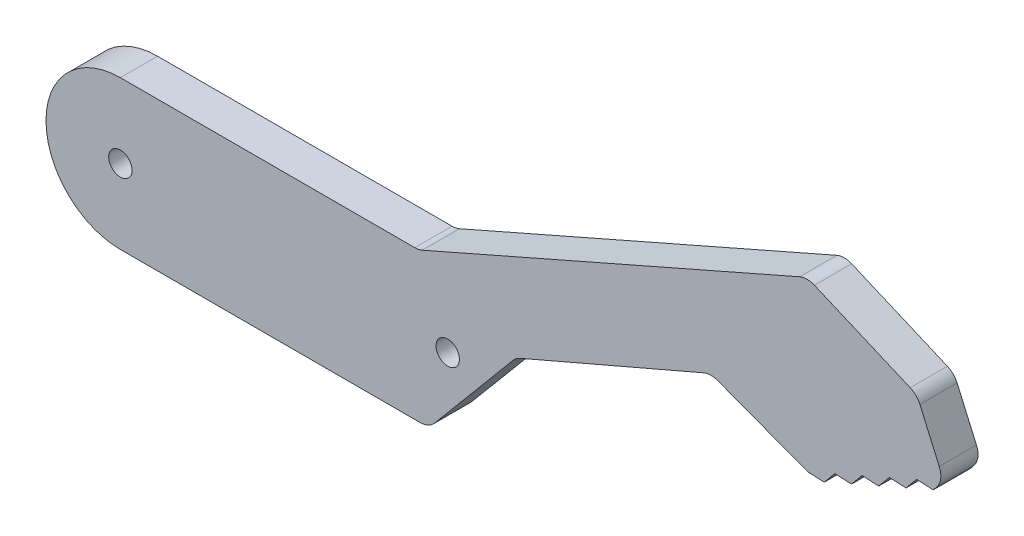
ISO-10303-21;
HEADER;
FILE_DESCRIPTION(('STEP AP214'),'2;1');
FILE_NAME('part.step','',(''),(''),'','','');
FILE_SCHEMA(('AUTOMOTIVE_DESIGN { 1 0 10303 214 1 1 1 1 }'));
ENDSEC;
DATA;
#1=APPLICATION_CONTEXT('core data for automotive mechanical design processes');
#2=APPLICATION_PROTOCOL_DEFINITION('international standard','automotive_design',2000,#1);
#3=PRODUCT_CONTEXT('',#1,'mechanical');
#4=PRODUCT('Part','Part','',(#3));
#5=PRODUCT_RELATED_PRODUCT_CATEGORY('part','',(#4));
#6=PRODUCT_DEFINITION_FORMATION('','',#4);
#7=PRODUCT_DEFINITION_CONTEXT('part definition',#1,'design');
#8=PRODUCT_DEFINITION('design','',#6,#7);
#9=PRODUCT_DEFINITION_SHAPE('','',#8);
#10=(LENGTH_UNIT() NAMED_UNIT(*) SI_UNIT(.MILLI.,.METRE.));
#11=(NAMED_UNIT(*) PLANE_ANGLE_UNIT() SI_UNIT($,.RADIAN.));
#12=(NAMED_UNIT(*) SI_UNIT($,.STERADIAN.) SOLID_ANGLE_UNIT());
#13=UNCERTAINTY_MEASURE_WITH_UNIT(LENGTH_MEASURE(1.E-05),#10,'distance_accuracy_value','');
#14=(GEOMETRIC_REPRESENTATION_CONTEXT(3) GLOBAL_UNCERTAINTY_ASSIGNED_CONTEXT((#13)) GLOBAL_UNIT_ASSIGNED_CONTEXT((#10,
#11,#12)) REPRESENTATION_CONTEXT('',''));
#15=CARTESIAN_POINT('',(0.,0.,0.));
#16=DIRECTION('',(0.,0.,1.));
#17=DIRECTION('',(1.,0.,0.));
#18=AXIS2_PLACEMENT_3D('',#15,#16,#17);
#19=CARTESIAN_POINT('',(58.5331131388832,-49.0978644296095,10.));
#20=DIRECTION('',(0.766155606422822,-0.6426551071507,0.));
#21=DIRECTION('',(0.6426551071507,0.766155606422822,0.));
#22=AXIS2_PLACEMENT_3D('',#19,#20,#21);
#23=PLANE('',#22);
#24=DIRECTION('',(-0.6426551071507,-0.766155606422822,0.));
#25=VECTOR('',#24,1.);
#26=CARTESIAN_POINT('',(58.5331131388832,-49.0978644296095,0.));
#27=LINE('',#26,#25);
#28=CARTESIAN_POINT('',(105.601666444923,7.01596023369886,0.));
#29=VERTEX_POINT('',#28);
#30=CARTESIAN_POINT('',(84.4392588597991,-18.2132755357535,0.));
#31=VERTEX_POINT('',#30);
#32=EDGE_CURVE('E404',#29,#31,#27,.T.);
#33=ORIENTED_EDGE('',*,*,#32,.F.);
#34=DIRECTION('',(0.,0.,-1.));
#35=VECTOR('',#34,1.);
#36=CARTESIAN_POINT('',(105.601666444923,7.01596023369886,10.));
#37=LINE('',#36,#35);
#38=CARTESIAN_POINT('',(105.601666444923,7.01596023369886,10.));
#39=VERTEX_POINT('',#38);
#40=EDGE_CURVE('E310',#29,#39,#37,.F.);
#41=ORIENTED_EDGE('',*,*,#40,.T.);
#42=DIRECTION('',(-0.6426551071507,-0.766155606422822,0.));
#43=VECTOR('',#42,1.);
#44=CARTESIAN_POINT('',(58.5331131388832,-49.0978644296095,10.));
#45=LINE('',#44,#43);
#46=CARTESIAN_POINT('',(84.4392588597991,-18.2132755357535,10.));
#47=VERTEX_POINT('',#46);
#48=EDGE_CURVE('E865',#39,#47,#45,.T.);
#49=ORIENTED_EDGE('',*,*,#48,.T.);
#50=DIRECTION('',(0.,0.,-1.));
#51=VECTOR('',#50,1.);
#52=CARTESIAN_POINT('',(84.4392588597991,-18.2132755357535,0.));
#53=LINE('',#52,#51);
#54=EDGE_CURVE('E306',#47,#31,#53,.T.);
#55=ORIENTED_EDGE('',*,*,#54,.T.);
#56=EDGE_LOOP('',(#33,#41,#49,#55));
#57=FACE_BOUND('',#56,.T.);
#58=ADVANCED_FACE('F43',(#57),#23,.T.);
#59=CARTESIAN_POINT('',(13.8136134535087,-32.0122174687386,10.));
#60=DIRECTION('',(0.39619803148616,-0.918165083112232,0.));
#61=DIRECTION('',(0.918165083112232,0.39619803148616,0.));
#62=AXIS2_PLACEMENT_3D('',#59,#60,#61);
#63=PLANE('',#62);
#64=DIRECTION('',(-0.918165083112232,-0.39619803148616,0.));
#65=VECTOR('',#64,1.);
#66=CARTESIAN_POINT('',(13.8136134535087,-32.0122174687386,0.));
#67=LINE('',#66,#65);
#68=CARTESIAN_POINT('',(156.8071709302,29.6910285264515,0.));
#69=VERTEX_POINT('',#68);
#70=CARTESIAN_POINT('',(107.451454319606,8.39351011350651,0.));
#71=VERTEX_POINT('',#70);
#72=EDGE_CURVE('E408',#69,#71,#67,.T.);
#73=ORIENTED_EDGE('',*,*,#72,.F.);
#74=DIRECTION('',(0.,0.,-1.));
#75=VECTOR('',#74,1.);
#76=CARTESIAN_POINT('',(156.8071709302,29.6910285264515,10.));
#77=LINE('',#76,#75);
#78=CARTESIAN_POINT('',(156.8071709302,29.6910285264515,10.));
#79=VERTEX_POINT('',#78);
#80=EDGE_CURVE('E303',#69,#79,#77,.F.);
#81=ORIENTED_EDGE('',*,*,#80,.T.);
#82=DIRECTION('',(-0.918165083112232,-0.39619803148616,0.));
#83=VECTOR('',#82,1.);
#84=CARTESIAN_POINT('',(13.8136134535087,-32.0122174687386,10.));
#85=LINE('',#84,#83);
#86=CARTESIAN_POINT('',(107.451454319606,8.39351011350651,10.));
#87=VERTEX_POINT('',#86);
#88=EDGE_CURVE('E872',#79,#87,#85,.T.);
#89=ORIENTED_EDGE('',*,*,#88,.T.);
#90=DIRECTION('',(0.,0.,-1.));
#91=VECTOR('',#90,1.);
#92=CARTESIAN_POINT('',(107.451454319606,8.39351011350651,0.));
#93=LINE('',#92,#91);
#94=EDGE_CURVE('E299',#87,#71,#93,.T.);
#95=ORIENTED_EDGE('',*,*,#94,.T.);
#96=EDGE_LOOP('',(#73,#81,#89,#95));
#97=FACE_BOUND('',#96,.T.);
#98=ADVANCED_FACE('F587',(#97),#63,.T.);
#99=CARTESIAN_POINT('',(29.8153393740067,79.0738902355573,10.));
#100=DIRECTION('',(-0.352810047583274,-0.935694966495112,0.));
#101=DIRECTION('',(0.935694966495112,-0.352810047583274,0.));
#102=AXIS2_PLACEMENT_3D('',#99,#100,#101);
#103=PLANE('',#102);
#104=DIRECTION('',(-0.935694966495112,0.352810047583274,0.));
#105=VECTOR('',#104,1.);
#106=CARTESIAN_POINT('',(29.8153393740067,79.0738902355573,0.));
#107=LINE('',#106,#105);
#108=CARTESIAN_POINT('',(184.023245086636,20.9287676258012,0.));
#109=VERTEX_POINT('',#108);
#110=CARTESIAN_POINT('',(160.552211325547,29.7786779433659,0.));
#111=VERTEX_POINT('',#110);
#112=EDGE_CURVE('E412',#109,#111,#107,.T.);
#113=ORIENTED_EDGE('',*,*,#112,.F.);
#114=DIRECTION('',(0.,0.,-1.));
#115=VECTOR('',#114,1.);
#116=CARTESIAN_POINT('',(184.023245086636,20.9287676258012,10.));
#117=LINE('',#116,#115);
#118=CARTESIAN_POINT('',(184.023245086636,20.9287676258012,10.));
#119=VERTEX_POINT('',#118);
#120=EDGE_CURVE('E282',#109,#119,#117,.F.);
#121=ORIENTED_EDGE('',*,*,#120,.T.);
#122=DIRECTION('',(-0.935694966495112,0.352810047583274,0.));
#123=VECTOR('',#122,1.);
#124=CARTESIAN_POINT('',(29.8153393740067,79.0738902355573,10.));
#125=LINE('',#124,#123);
#126=CARTESIAN_POINT('',(160.552211325547,29.7786779433659,10.));
#127=VERTEX_POINT('',#126);
#128=EDGE_CURVE('E237',#119,#127,#125,.T.);
#129=ORIENTED_EDGE('',*,*,#128,.T.);
#130=DIRECTION('',(0.,0.,-1.));
#131=VECTOR('',#130,1.);
#132=CARTESIAN_POINT('',(160.552211325547,29.7786779433659,0.));
#133=LINE('',#132,#131);
#134=EDGE_CURVE('E278',#127,#111,#133,.T.);
#135=ORIENTED_EDGE('',*,*,#134,.T.);
#136=EDGE_LOOP('',(#113,#121,#129,#135));
#137=FACE_BOUND('',#136,.T.);
#138=ADVANCED_FACE('F593',(#137),#103,.T.);
#139=CARTESIAN_POINT('',(1.49259334809687,29.8242520221806,10.));
#140=DIRECTION('',(0.0499837398291641,0.998750031665927,0.));
#141=DIRECTION('',(-0.998750031665927,0.0499837398291641,0.));
#142=AXIS2_PLACEMENT_3D('',#139,#140,#141);
#143=PLANE('',#142);
#144=DIRECTION('',(0.998750031665927,-0.0499837398291641,0.));
#145=VECTOR('',#144,1.);
#146=CARTESIAN_POINT('',(1.49259334809687,29.8242520221806,10.));
#147=LINE('',#146,#145);
#148=CARTESIAN_POINT('',(185.537376625407,20.6134922999471,10.));
#149=VERTEX_POINT('',#148);
#150=CARTESIAN_POINT('',(189.22217950757,20.4290815637826,10.));
#151=VERTEX_POINT('',#150);
#152=EDGE_CURVE('E223',#149,#151,#147,.T.);
#153=ORIENTED_EDGE('',*,*,#152,.F.);
#154=DIRECTION('',(0.,0.,-1.));
#155=VECTOR('',#154,1.);
#156=CARTESIAN_POINT('',(185.537376625407,20.6134922999471,0.));
#157=LINE('',#156,#155);
#158=CARTESIAN_POINT('',(185.537376625407,20.6134922999471,0.));
#159=VERTEX_POINT('',#158);
#160=EDGE_CURVE('E254',#149,#159,#157,.T.);
#161=ORIENTED_EDGE('',*,*,#160,.T.);
#162=DIRECTION('',(0.998750031665927,-0.0499837398291641,0.));
#163=VECTOR('',#162,1.);
#164=CARTESIAN_POINT('',(1.49259334809687,29.8242520221806,0.));
#165=LINE('',#164,#163);
#166=CARTESIAN_POINT('',(189.22217950757,20.4290815637826,0.));
#167=VERTEX_POINT('',#166);
#168=EDGE_CURVE('E251',#159,#167,#165,.T.);
#169=ORIENTED_EDGE('',*,*,#168,.T.);
#170=DIRECTION('',(0.,0.,-1.));
#171=VECTOR('',#170,1.);
#172=CARTESIAN_POINT('',(189.22217950757,20.4290815637826,10.));
#173=LINE('',#172,#171);
#174=EDGE_CURVE('E243',#151,#167,#173,.T.);
#175=ORIENTED_EDGE('',*,*,#174,.F.);
#176=EDGE_LOOP('',(#153,#161,#169,#175));
#177=FACE_BOUND('',#176,.T.);
#178=ADVANCED_FACE('F249',(#177),#143,.F.);
#179=CARTESIAN_POINT('',(101.8589459567,-84.6699349148504,10.));
#180=DIRECTION('',(-0.769009781435244,0.639237010862887,0.));
#181=DIRECTION('',(-0.639237010862887,-0.769009781435244,0.));
#182=AXIS2_PLACEMENT_3D('',#179,#180,#181);
#183=PLANE('',#182);
#184=DIRECTION('',(0.639237010862887,0.769009781435244,0.));
#185=VECTOR('',#184,1.);
#186=CARTESIAN_POINT('',(101.8589459567,-84.6699349148504,0.));
#187=LINE('',#186,#185);
#188=CARTESIAN_POINT('',(192.080934327617,23.8681978570855,0.));
#189=VERTEX_POINT('',#188);
#190=EDGE_CURVE('E418',#167,#189,#187,.T.);
#191=ORIENTED_EDGE('',*,*,#190,.T.);
#192=DIRECTION('',(0.,0.,-1.));
#193=VECTOR('',#192,1.);
#194=CARTESIAN_POINT('',(192.080934327617,23.8681978570855,10.));
#195=LINE('',#194,#193);
#196=CARTESIAN_POINT('',(192.080934327617,23.8681978570855,10.));
#197=VERTEX_POINT('',#196);
#198=EDGE_CURVE('E245',#197,#189,#195,.T.);
#199=ORIENTED_EDGE('',*,*,#198,.F.);
#200=DIRECTION('',(0.639237010862887,0.769009781435244,0.));
#201=VECTOR('',#200,1.);
#202=CARTESIAN_POINT('',(101.8589459567,-84.6699349148504,10.));
#203=LINE('',#202,#201);
#204=EDGE_CURVE('E228',#151,#197,#203,.T.);
#205=ORIENTED_EDGE('',*,*,#204,.F.);
#206=ORIENTED_EDGE('',*,*,#174,.T.);
#207=EDGE_LOOP('',(#191,#199,#205,#206));
#208=FACE_BOUND('',#207,.T.);
#209=ADVANCED_FACE('F242',(#208),#183,.F.);
#210=CARTESIAN_POINT('',(1.67142061213996,33.3974887635115,10.));
#211=DIRECTION('',(0.0499837398291364,0.998750031665929,0.));
#212=DIRECTION('',(-0.998750031665929,0.0499837398291364,0.));
#213=AXIS2_PLACEMENT_3D('',#210,#211,#212);
#214=PLANE('',#213);
#215=DIRECTION('',(0.998750031665929,-0.0499837398291364,0.));
#216=VECTOR('',#215,1.);
#217=CARTESIAN_POINT('',(1.67142061213996,33.3974887635115,0.));
#218=LINE('',#217,#216);
#219=CARTESIAN_POINT('',(196.547480254287,23.6446637770303,0.));
#220=VERTEX_POINT('',#219);
#221=EDGE_CURVE('E421',#189,#220,#218,.T.);
#222=ORIENTED_EDGE('',*,*,#221,.T.);
#223=DIRECTION('',(0.,0.,-1.));
#224=VECTOR('',#223,1.);
#225=CARTESIAN_POINT('',(196.547480254287,23.6446637770303,10.));
#226=LINE('',#225,#224);
#227=CARTESIAN_POINT('',(196.547480254287,23.6446637770303,10.));
#228=VERTEX_POINT('',#227);
#229=EDGE_CURVE('E260',#228,#220,#226,.T.);
#230=ORIENTED_EDGE('',*,*,#229,.F.);
#231=DIRECTION('',(0.998750031665929,-0.0499837398291364,0.));
#232=VECTOR('',#231,1.);
#233=CARTESIAN_POINT('',(1.67142061213996,33.3974887635115,10.));
#234=LINE('',#233,#232);
#235=EDGE_CURVE('E247',#197,#228,#234,.T.);
#236=ORIENTED_EDGE('',*,*,#235,.F.);
#237=ORIENTED_EDGE('',*,*,#198,.T.);
#238=EDGE_LOOP('',(#222,#230,#236,#237));
#239=FACE_BOUND('',#238,.T.);
#240=ADVANCED_FACE('F507',(#239),#214,.F.);
#241=CARTESIAN_POINT('',(104.610238991338,-86.9569387708878,10.));
#242=DIRECTION('',(-0.769009781435229,0.639237010862905,0.));
#243=DIRECTION('',(-0.639237010862905,-0.769009781435229,0.));
#244=AXIS2_PLACEMENT_3D('',#241,#242,#243);
#245=PLANE('',#244);
#246=DIRECTION('',(0.639237010862905,0.769009781435229,0.));
#247=VECTOR('',#246,1.);
#248=CARTESIAN_POINT('',(104.610238991338,-86.9569387708878,0.));
#249=LINE('',#248,#247);
#250=CARTESIAN_POINT('',(199.406235074333,27.0837800703332,0.));
#251=VERTEX_POINT('',#250);
#252=EDGE_CURVE('E425',#220,#251,#249,.T.);
#253=ORIENTED_EDGE('',*,*,#252,.T.);
#254=DIRECTION('',(0.,0.,-1.));
#255=VECTOR('',#254,1.);
#256=CARTESIAN_POINT('',(199.406235074333,27.0837800703332,10.));
#257=LINE('',#256,#255);
#258=CARTESIAN_POINT('',(199.406235074333,27.0837800703332,10.));
#259=VERTEX_POINT('',#258);
#260=EDGE_CURVE('E495',#259,#251,#257,.T.);
#261=ORIENTED_EDGE('',*,*,#260,.F.);
#262=DIRECTION('',(0.639237010862905,0.769009781435229,0.));
#263=VECTOR('',#262,1.);
#264=CARTESIAN_POINT('',(104.610238991338,-86.9569387708878,10.));
#265=LINE('',#264,#263);
#266=EDGE_CURVE('E505',#228,#259,#265,.T.);
#267=ORIENTED_EDGE('',*,*,#266,.F.);
#268=ORIENTED_EDGE('',*,*,#229,.T.);
#269=EDGE_LOOP('',(#253,#261,#267,#268));
#270=FACE_BOUND('',#269,.T.);
#271=ADVANCED_FACE('F502',(#270),#245,.F.);
#272=CARTESIAN_POINT('',(1.85024787618502,36.9707255048512,10.));
#273=DIRECTION('',(0.0499837398291553,0.998750031665928,0.));
#274=DIRECTION('',(-0.998750031665928,0.0499837398291553,0.));
#275=AXIS2_PLACEMENT_3D('',#272,#273,#274);
#276=PLANE('',#275);
#277=DIRECTION('',(0.998750031665928,-0.0499837398291553,0.));
#278=VECTOR('',#277,1.);
#279=CARTESIAN_POINT('',(1.85024787618502,36.9707255048512,0.));
#280=LINE('',#279,#278);
#281=CARTESIAN_POINT('',(203.872781001003,26.8602459902779,0.));
#282=VERTEX_POINT('',#281);
#283=EDGE_CURVE('E429',#251,#282,#280,.T.);
#284=ORIENTED_EDGE('',*,*,#283,.T.);
#285=DIRECTION('',(0.,0.,-1.));
#286=VECTOR('',#285,1.);
#287=CARTESIAN_POINT('',(203.872781001003,26.8602459902779,10.));
#288=LINE('',#287,#286);
#289=CARTESIAN_POINT('',(203.872781001003,26.8602459902779,10.));
#290=VERTEX_POINT('',#289);
#291=EDGE_CURVE('E491',#290,#282,#288,.T.);
#292=ORIENTED_EDGE('',*,*,#291,.F.);
#293=DIRECTION('',(0.998750031665928,-0.0499837398291553,0.));
#294=VECTOR('',#293,1.);
#295=CARTESIAN_POINT('',(1.85024787618502,36.9707255048512,10.));
#296=LINE('',#295,#294);
#297=EDGE_CURVE('E512',#259,#290,#296,.T.);
#298=ORIENTED_EDGE('',*,*,#297,.F.);
#299=ORIENTED_EDGE('',*,*,#260,.T.);
#300=EDGE_LOOP('',(#284,#292,#298,#299));
#301=FACE_BOUND('',#300,.T.);
#302=ADVANCED_FACE('F510',(#301),#276,.F.);
#303=CARTESIAN_POINT('',(107.361532025985,-89.2439426269246,10.));
#304=DIRECTION('',(-0.769009781435243,0.639237010862887,0.));
#305=DIRECTION('',(-0.639237010862887,-0.769009781435243,0.));
#306=AXIS2_PLACEMENT_3D('',#303,#304,#305);
#307=PLANE('',#306);
#308=DIRECTION('',(0.639237010862887,0.769009781435243,0.));
#309=VECTOR('',#308,1.);
#310=CARTESIAN_POINT('',(107.361532025985,-89.2439426269246,0.));
#311=LINE('',#310,#309);
#312=CARTESIAN_POINT('',(206.73153582105,30.2993622835808,0.));
#313=VERTEX_POINT('',#312);
#314=EDGE_CURVE('E433',#282,#313,#311,.T.);
#315=ORIENTED_EDGE('',*,*,#314,.T.);
#316=DIRECTION('',(0.,0.,-1.));
#317=VECTOR('',#316,1.);
#318=CARTESIAN_POINT('',(206.73153582105,30.2993622835808,10.));
#319=LINE('',#318,#317);
#320=CARTESIAN_POINT('',(206.73153582105,30.2993622835808,10.));
#321=VERTEX_POINT('',#320);
#322=EDGE_CURVE('E487',#321,#313,#319,.T.);
#323=ORIENTED_EDGE('',*,*,#322,.F.);
#324=DIRECTION('',(0.639237010862887,0.769009781435243,0.));
#325=VECTOR('',#324,1.);
#326=CARTESIAN_POINT('',(107.361532025985,-89.2439426269246,10.));
#327=LINE('',#326,#325);
#328=EDGE_CURVE('E515',#290,#321,#327,.T.);
#329=ORIENTED_EDGE('',*,*,#328,.F.);
#330=ORIENTED_EDGE('',*,*,#291,.T.);
#331=EDGE_LOOP('',(#315,#323,#329,#330));
#332=FACE_BOUND('',#331,.T.);
#333=ADVANCED_FACE('F577',(#332),#307,.F.);
#334=CARTESIAN_POINT('',(2.02907514022966,40.5439622461889,10.));
#335=DIRECTION('',(0.0499837398291631,0.998750031665927,0.));
#336=DIRECTION('',(-0.998750031665927,0.0499837398291631,0.));
#337=AXIS2_PLACEMENT_3D('',#334,#335,#336);
#338=PLANE('',#337);
#339=DIRECTION('',(0.998750031665927,-0.0499837398291631,0.));
#340=VECTOR('',#339,1.);
#341=CARTESIAN_POINT('',(2.02907514022966,40.5439622461889,0.));
#342=LINE('',#341,#340);
#343=CARTESIAN_POINT('',(211.19808174772,30.0758282035255,0.));
#344=VERTEX_POINT('',#343);
#345=EDGE_CURVE('E437',#313,#344,#342,.T.);
#346=ORIENTED_EDGE('',*,*,#345,.T.);
#347=DIRECTION('',(0.,0.,-1.));
#348=VECTOR('',#347,1.);
#349=CARTESIAN_POINT('',(211.19808174772,30.0758282035255,10.));
#350=LINE('',#349,#348);
#351=CARTESIAN_POINT('',(211.19808174772,30.0758282035255,10.));
#352=VERTEX_POINT('',#351);
#353=EDGE_CURVE('E483',#352,#344,#350,.T.);
#354=ORIENTED_EDGE('',*,*,#353,.F.);
#355=DIRECTION('',(0.998750031665927,-0.0499837398291631,0.));
#356=VECTOR('',#355,1.);
#357=CARTESIAN_POINT('',(2.02907514022966,40.5439622461889,10.));
#358=LINE('',#357,#356);
#359=EDGE_CURVE('E524',#321,#352,#358,.T.);
#360=ORIENTED_EDGE('',*,*,#359,.F.);
#361=ORIENTED_EDGE('',*,*,#322,.T.);
#362=EDGE_LOOP('',(#346,#354,#360,#361));
#363=FACE_BOUND('',#362,.T.);
#364=ADVANCED_FACE('F574',(#363),#338,.F.);
#365=CARTESIAN_POINT('',(110.112825060627,-91.5309464829618,10.));
#366=DIRECTION('',(-0.769009781435243,0.639237010862888,0.));
#367=DIRECTION('',(-0.639237010862888,-0.769009781435243,0.));
#368=AXIS2_PLACEMENT_3D('',#365,#366,#367);
#369=PLANE('',#368);
#370=DIRECTION('',(0.639237010862888,0.769009781435243,0.));
#371=VECTOR('',#370,1.);
#372=CARTESIAN_POINT('',(110.112825060627,-91.5309464829618,0.));
#373=LINE('',#372,#371);
#374=CARTESIAN_POINT('',(214.056836567766,33.5149444968284,0.));
#375=VERTEX_POINT('',#374);
#376=EDGE_CURVE('E441',#344,#375,#373,.T.);
#377=ORIENTED_EDGE('',*,*,#376,.T.);
#378=DIRECTION('',(0.,0.,-1.));
#379=VECTOR('',#378,1.);
#380=CARTESIAN_POINT('',(214.056836567766,33.5149444968284,10.));
#381=LINE('',#380,#379);
#382=CARTESIAN_POINT('',(214.056836567766,33.5149444968284,10.));
#383=VERTEX_POINT('',#382);
#384=EDGE_CURVE('E479',#383,#375,#381,.T.);
#385=ORIENTED_EDGE('',*,*,#384,.F.);
#386=DIRECTION('',(0.639237010862888,0.769009781435243,0.));
#387=VECTOR('',#386,1.);
#388=CARTESIAN_POINT('',(110.112825060627,-91.5309464829618,10.));
#389=LINE('',#388,#387);
#390=EDGE_CURVE('E528',#352,#383,#389,.T.);
#391=ORIENTED_EDGE('',*,*,#390,.F.);
#392=ORIENTED_EDGE('',*,*,#353,.T.);
#393=EDGE_LOOP('',(#377,#385,#391,#392));
#394=FACE_BOUND('',#393,.T.);
#395=ADVANCED_FACE('F572',(#394),#369,.F.);
#396=CARTESIAN_POINT('',(2.20790240427694,44.1171989875366,10.));
#397=DIRECTION('',(0.049983739829218,0.998750031665925,0.));
#398=DIRECTION('',(-0.998750031665925,0.049983739829218,0.));
#399=AXIS2_PLACEMENT_3D('',#396,#397,#398);
#400=PLANE('',#399);
#401=DIRECTION('',(0.998750031665924,-0.049983739829218,0.));
#402=VECTOR('',#401,1.);
#403=CARTESIAN_POINT('',(2.20790240427694,44.1171989875366,0.));
#404=LINE('',#403,#402);
#405=CARTESIAN_POINT('',(218.523382494437,33.2914104167728,0.));
#406=VERTEX_POINT('',#405);
#407=EDGE_CURVE('E445',#375,#406,#404,.T.);
#408=ORIENTED_EDGE('',*,*,#407,.T.);
#409=DIRECTION('',(0.,0.,-1.));
#410=VECTOR('',#409,1.);
#411=CARTESIAN_POINT('',(218.523382494437,33.2914104167728,10.));
#412=LINE('',#411,#410);
#413=CARTESIAN_POINT('',(218.523382494437,33.2914104167728,10.));
#414=VERTEX_POINT('',#413);
#415=EDGE_CURVE('E475',#414,#406,#412,.T.);
#416=ORIENTED_EDGE('',*,*,#415,.F.);
#417=DIRECTION('',(0.998750031665924,-0.049983739829218,0.));
#418=VECTOR('',#417,1.);
#419=CARTESIAN_POINT('',(2.20790240427694,44.1171989875366,10.));
#420=LINE('',#419,#418);
#421=EDGE_CURVE('E532',#383,#414,#420,.T.);
#422=ORIENTED_EDGE('',*,*,#421,.F.);
#423=ORIENTED_EDGE('',*,*,#384,.T.);
#424=EDGE_LOOP('',(#408,#416,#422,#423));
#425=FACE_BOUND('',#424,.T.);
#426=ADVANCED_FACE('F568',(#425),#400,.F.);
#427=CARTESIAN_POINT('',(112.864118095284,-93.8179503389985,10.));
#428=DIRECTION('',(-0.769009781435284,0.639237010862838,0.));
#429=DIRECTION('',(-0.639237010862838,-0.769009781435284,0.));
#430=AXIS2_PLACEMENT_3D('',#427,#428,#429);
#431=PLANE('',#430);
#432=DIRECTION('',(0.639237010862838,0.769009781435284,0.));
#433=VECTOR('',#432,1.);
#434=CARTESIAN_POINT('',(112.864118095284,-93.8179503389985,0.));
#435=LINE('',#434,#433);
#436=CARTESIAN_POINT('',(219.406786316582,34.3541557970355,0.));
#437=VERTEX_POINT('',#436);
#438=EDGE_CURVE('E449',#406,#437,#435,.T.);
#439=ORIENTED_EDGE('',*,*,#438,.T.);
#440=DIRECTION('',(0.,0.,-1.));
#441=VECTOR('',#440,1.);
#442=CARTESIAN_POINT('',(219.406786316582,34.3541557970354,10.));
#443=LINE('',#442,#441);
#444=CARTESIAN_POINT('',(219.406786316582,34.3541557970355,10.));
#445=VERTEX_POINT('',#444);
#446=EDGE_CURVE('E340',#437,#445,#443,.F.);
#447=ORIENTED_EDGE('',*,*,#446,.T.);
#448=DIRECTION('',(0.639237010862838,0.769009781435284,0.));
#449=VECTOR('',#448,1.);
#450=CARTESIAN_POINT('',(112.864118095284,-93.8179503389985,10.));
#451=LINE('',#450,#449);
#452=EDGE_CURVE('E536',#414,#445,#451,.T.);
#453=ORIENTED_EDGE('',*,*,#452,.F.);
#454=ORIENTED_EDGE('',*,*,#415,.T.);
#455=EDGE_LOOP('',(#439,#447,#453,#454));
#456=FACE_BOUND('',#455,.T.);
#457=ADVANCED_FACE('F565',(#456),#431,.F.);
#458=CARTESIAN_POINT('',(199.133809949654,87.4136311218824,10.));
#459=DIRECTION('',(0.915662593339567,0.401947776655946,0.));
#460=DIRECTION('',(-0.401947776655946,0.915662593339567,0.));
#461=AXIS2_PLACEMENT_3D('',#458,#459,#460);
#462=PLANE('',#461);
#463=DIRECTION('',(0.401947776655946,-0.915662593339567,0.));
#464=VECTOR('',#463,1.);
#465=CARTESIAN_POINT('',(199.133809949654,87.4136311218824,0.));
#466=LINE('',#465,#464);
#467=CARTESIAN_POINT('',(214.94277171395,51.3998109994436,0.));
#468=VERTEX_POINT('',#467);
#469=CARTESIAN_POINT('',(220.140050376104,39.5600797346294,0.));
#470=VERTEX_POINT('',#469);
#471=EDGE_CURVE('E453',#468,#470,#466,.T.);
#472=ORIENTED_EDGE('',*,*,#471,.F.);
#473=DIRECTION('',(0.,0.,-1.));
#474=VECTOR('',#473,1.);
#475=CARTESIAN_POINT('',(214.94277171395,51.3998109994436,10.));
#476=LINE('',#475,#474);
#477=CARTESIAN_POINT('',(214.94277171395,51.3998109994436,10.));
#478=VERTEX_POINT('',#477);
#479=EDGE_CURVE('E337',#468,#478,#476,.F.);
#480=ORIENTED_EDGE('',*,*,#479,.T.);
#481=DIRECTION('',(0.401947776655946,-0.915662593339567,0.));
#482=VECTOR('',#481,1.);
#483=CARTESIAN_POINT('',(199.133809949654,87.4136311218824,10.));
#484=LINE('',#483,#482);
#485=CARTESIAN_POINT('',(220.140050376104,39.5600797346294,10.));
#486=VERTEX_POINT('',#485);
#487=EDGE_CURVE('E540',#478,#486,#484,.T.);
#488=ORIENTED_EDGE('',*,*,#487,.T.);
#489=DIRECTION('',(0.,0.,-1.));
#490=VECTOR('',#489,1.);
#491=CARTESIAN_POINT('',(220.140050376104,39.5600797346294,0.));
#492=LINE('',#491,#490);
#493=EDGE_CURVE('E333',#486,#470,#492,.T.);
#494=ORIENTED_EDGE('',*,*,#493,.T.);
#495=EDGE_LOOP('',(#472,#480,#488,#494));
#496=FACE_BOUND('',#495,.T.);
#497=ADVANCED_FACE('F558',(#496),#462,.T.);
#498=CARTESIAN_POINT('',(52.1695232795642,122.304623107969,10.));
#499=DIRECTION('',(0.392350992350014,0.919815578690619,0.));
#500=DIRECTION('',(-0.919815578690619,0.392350992350014,0.));
#501=AXIS2_PLACEMENT_3D('',#498,#499,#500);
#502=PLANE('',#501);
#503=DIRECTION('',(0.919815578690619,-0.392350992350014,0.));
#504=VECTOR('',#503,1.);
#505=CARTESIAN_POINT('',(52.1695232795642,122.304623107969,0.));
#506=LINE('',#505,#504);
#507=CARTESIAN_POINT('',(186.575775549307,64.9731017924149,0.));
#508=VERTEX_POINT('',#507);
#509=CARTESIAN_POINT('',(212.326213709002,53.989150009617,0.));
#510=VERTEX_POINT('',#509);
#511=EDGE_CURVE('E372',#508,#510,#506,.T.);
#512=ORIENTED_EDGE('',*,*,#511,.F.);
#513=DIRECTION('',(0.,0.,-1.));
#514=VECTOR('',#513,1.);
#515=CARTESIAN_POINT('',(186.575775549307,64.9731017924149,10.));
#516=LINE('',#515,#514);
#517=CARTESIAN_POINT('',(186.575775549307,64.9731017924149,10.));
#518=VERTEX_POINT('',#517);
#519=EDGE_CURVE('E330',#508,#518,#516,.F.);
#520=ORIENTED_EDGE('',*,*,#519,.T.);
#521=DIRECTION('',(0.919815578690619,-0.392350992350014,0.));
#522=VECTOR('',#521,1.);
#523=CARTESIAN_POINT('',(52.1695232795642,122.304623107969,10.));
#524=LINE('',#523,#522);
#525=CARTESIAN_POINT('',(212.326213709002,53.989150009617,10.));
#526=VERTEX_POINT('',#525);
#527=EDGE_CURVE('E389',#518,#526,#524,.T.);
#528=ORIENTED_EDGE('',*,*,#527,.T.);
#529=DIRECTION('',(0.,0.,-1.));
#530=VECTOR('',#529,1.);
#531=CARTESIAN_POINT('',(212.326213709002,53.989150009617,10.));
#532=LINE('',#531,#530);
#533=EDGE_CURVE('E326',#526,#510,#532,.T.);
#534=ORIENTED_EDGE('',*,*,#533,.T.);
#535=EDGE_LOOP('',(#512,#520,#528,#534));
#536=FACE_BOUND('',#535,.T.);
#537=ADVANCED_FACE('F549',(#536),#502,.T.);
#538=CARTESIAN_POINT('',(5.59630274452736,-12.7487334966738,10.));
#539=DIRECTION('',(-0.401947776655948,0.915662593339566,0.));
#540=DIRECTION('',(-0.915662593339566,-0.401947776655948,0.));
#541=AXIS2_PLACEMENT_3D('',#538,#539,#540);
#542=PLANE('',#541);
#543=DIRECTION('',(0.915662593339566,0.401947776655948,0.));
#544=VECTOR('',#543,1.);
#545=CARTESIAN_POINT('',(5.59630274452736,-12.7487334966738,0.));
#546=LINE('',#545,#544);
#547=CARTESIAN_POINT('',(81.1606298751134,20.4216870333022,0.));
#548=VERTEX_POINT('',#547);
#549=CARTESIAN_POINT('',(182.604281704277,64.9523368656596,0.));
#550=VERTEX_POINT('',#549);
#551=EDGE_CURVE('E360',#548,#550,#546,.T.);
#552=ORIENTED_EDGE('',*,*,#551,.F.);
#553=DIRECTION('',(0.,0.,-1.));
#554=VECTOR('',#553,1.);
#555=CARTESIAN_POINT('',(81.1606298751135,20.4216870333022,10.));
#556=LINE('',#555,#554);
#557=CARTESIAN_POINT('',(81.1606298751134,20.4216870333022,10.));
#558=VERTEX_POINT('',#557);
#559=EDGE_CURVE('E323',#548,#558,#556,.F.);
#560=ORIENTED_EDGE('',*,*,#559,.T.);
#561=DIRECTION('',(0.915662593339566,0.401947776655948,0.));
#562=VECTOR('',#561,1.);
#563=CARTESIAN_POINT('',(5.59630274452736,-12.7487334966738,10.));
#564=LINE('',#563,#562);
#565=CARTESIAN_POINT('',(182.604281704277,64.9523368656596,10.));
#566=VERTEX_POINT('',#565);
#567=EDGE_CURVE('E383',#558,#566,#564,.T.);
#568=ORIENTED_EDGE('',*,*,#567,.T.);
#569=DIRECTION('',(0.,0.,-1.));
#570=VECTOR('',#569,1.);
#571=CARTESIAN_POINT('',(182.604281704277,64.9523368656596,10.));
#572=LINE('',#571,#570);
#573=EDGE_CURVE('E319',#566,#550,#572,.T.);
#574=ORIENTED_EDGE('',*,*,#573,.T.);
#575=EDGE_LOOP('',(#552,#560,#568,#574));
#576=FACE_BOUND('',#575,.T.);
#577=ADVANCED_FACE('F368',(#576),#542,.T.);
#578=CARTESIAN_POINT('',(0.,20.,10.));
#579=DIRECTION('',(0.,1.,0.));
#580=DIRECTION('',(-1.,0.,0.));
#581=AXIS2_PLACEMENT_3D('',#578,#579,#580);
#582=PLANE('',#581);
#583=DIRECTION('',(1.,0.,0.));
#584=VECTOR('',#583,1.);
#585=CARTESIAN_POINT('',(0.,20.,10.));
#586=LINE('',#585,#584);
#587=CARTESIAN_POINT('',(0.,20.,10.));
#588=VERTEX_POINT('',#587);
#589=CARTESIAN_POINT('',(79.1508909918337,20.,10.));
#590=VERTEX_POINT('',#589);
#591=EDGE_CURVE('E377',#588,#590,#586,.T.);
#592=ORIENTED_EDGE('',*,*,#591,.T.);
#593=DIRECTION('',(0.,0.,-1.));
#594=VECTOR('',#593,1.);
#595=CARTESIAN_POINT('',(79.1508909918337,20.,0.));
#596=LINE('',#595,#594);
#597=CARTESIAN_POINT('',(79.1508909918337,20.,0.));
#598=VERTEX_POINT('',#597);
#599=EDGE_CURVE('E315',#590,#598,#596,.T.);
#600=ORIENTED_EDGE('',*,*,#599,.T.);
#601=DIRECTION('',(1.,0.,0.));
#602=VECTOR('',#601,1.);
#603=CARTESIAN_POINT('',(0.,20.,0.));
#604=LINE('',#603,#602);
#605=CARTESIAN_POINT('',(0.,20.,0.));
#606=VERTEX_POINT('',#605);
#607=EDGE_CURVE('E363',#606,#598,#604,.T.);
#608=ORIENTED_EDGE('',*,*,#607,.F.);
#609=DIRECTION('',(0.,0.,-1.));
#610=VECTOR('',#609,1.);
#611=CARTESIAN_POINT('',(0.,20.,10.));
#612=LINE('',#611,#610);
#613=EDGE_CURVE('E378',#588,#606,#612,.T.);
#614=ORIENTED_EDGE('',*,*,#613,.F.);
#615=EDGE_LOOP('',(#592,#600,#608,#614));
#616=FACE_BOUND('',#615,.T.);
#617=ADVANCED_FACE('F376',(#616),#582,.T.);
#618=CARTESIAN_POINT('',(0.,0.,10.));
#619=DIRECTION('',(0.,0.,-1.));
#620=DIRECTION('',(-1.,0.,0.));
#621=AXIS2_PLACEMENT_3D('',#618,#619,#620);
#622=CYLINDRICAL_SURFACE('',#621,20.);
#623=CARTESIAN_POINT('',(0.,0.,0.));
#624=DIRECTION('',(0.,0.,1.));
#625=DIRECTION('',(1.,0.,0.));
#626=AXIS2_PLACEMENT_3D('',#623,#624,#625);
#627=CIRCLE('',#626,20.);
#628=CARTESIAN_POINT('',(0.,-20.,0.));
#629=VERTEX_POINT('',#628);
#630=EDGE_CURVE('E462',#606,#629,#627,.T.);
#631=ORIENTED_EDGE('',*,*,#630,.T.);
#632=DIRECTION('',(0.,0.,-1.));
#633=VECTOR('',#632,1.);
#634=CARTESIAN_POINT('',(0.,-20.,10.));
#635=LINE('',#634,#633);
#636=CARTESIAN_POINT('',(0.,-20.,10.));
#637=VERTEX_POINT('',#636);
#638=EDGE_CURVE('E395',#637,#629,#635,.T.);
#639=ORIENTED_EDGE('',*,*,#638,.F.);
#640=CARTESIAN_POINT('',(0.,0.,10.));
#641=DIRECTION('',(0.,0.,1.));
#642=DIRECTION('',(1.,0.,0.));
#643=AXIS2_PLACEMENT_3D('',#640,#641,#642);
#644=CIRCLE('',#643,20.);
#645=EDGE_CURVE('E382',#588,#637,#644,.T.);
#646=ORIENTED_EDGE('',*,*,#645,.F.);
#647=ORIENTED_EDGE('',*,*,#613,.T.);
#648=EDGE_LOOP('',(#631,#639,#646,#647));
#649=FACE_BOUND('',#648,.T.);
#650=ADVANCED_FACE('F603',(#649),#622,.T.);
#651=CARTESIAN_POINT('',(0.,0.,10.));
#652=DIRECTION('',(0.,0.,-1.));
#653=DIRECTION('',(-1.,0.,0.));
#654=AXIS2_PLACEMENT_3D('',#651,#652,#653);
#655=CYLINDRICAL_SURFACE('',#654,3.15);
#656=CARTESIAN_POINT('',(0.,0.,10.));
#657=DIRECTION('',(0.,0.,1.));
#658=DIRECTION('',(1.,0.,0.));
#659=AXIS2_PLACEMENT_3D('',#656,#657,#658);
#660=CIRCLE('',#659,3.15);
#661=CARTESIAN_POINT('',(3.15,0.,10.));
#662=VERTEX_POINT('',#661);
#663=EDGE_CURVE('E880',#662,#662,#660,.T.);
#664=ORIENTED_EDGE('',*,*,#663,.T.);
#665=EDGE_LOOP('',(#664));
#666=FACE_BOUND('',#665,.T.);
#667=CARTESIAN_POINT('',(0.,0.,0.));
#668=DIRECTION('',(0.,0.,1.));
#669=DIRECTION('',(1.,0.,0.));
#670=AXIS2_PLACEMENT_3D('',#667,#668,#669);
#671=CIRCLE('',#670,3.15);
#672=CARTESIAN_POINT('',(3.15,0.,0.));
#673=VERTEX_POINT('',#672);
#674=EDGE_CURVE('E400',#673,#673,#671,.T.);
#675=ORIENTED_EDGE('',*,*,#674,.F.);
#676=EDGE_LOOP('',(#675));
#677=FACE_BOUND('',#676,.T.);
#678=ADVANCED_FACE('F599',(#666,#677),#655,.F.);
#679=CARTESIAN_POINT('',(88.,0.,10.));
#680=DIRECTION('',(0.,0.,-1.));
#681=DIRECTION('',(-1.,0.,0.));
#682=AXIS2_PLACEMENT_3D('',#679,#680,#681);
#683=CYLINDRICAL_SURFACE('',#682,3.15);
#684=CARTESIAN_POINT('',(88.,0.,10.));
#685=DIRECTION('',(0.,0.,1.));
#686=DIRECTION('',(1.,0.,0.));
#687=AXIS2_PLACEMENT_3D('',#684,#685,#686);
#688=CIRCLE('',#687,3.15);
#689=CARTESIAN_POINT('',(91.15,0.,10.));
#690=VERTEX_POINT('',#689);
#691=EDGE_CURVE('E469',#690,#690,#688,.T.);
#692=ORIENTED_EDGE('',*,*,#691,.T.);
#693=EDGE_LOOP('',(#692));
#694=FACE_BOUND('',#693,.T.);
#695=CARTESIAN_POINT('',(88.,0.,0.));
#696=DIRECTION('',(0.,0.,1.));
#697=DIRECTION('',(1.,0.,0.));
#698=AXIS2_PLACEMENT_3D('',#695,#696,#697);
#699=CIRCLE('',#698,3.15);
#700=CARTESIAN_POINT('',(91.15,0.,0.));
#701=VERTEX_POINT('',#700);
#702=EDGE_CURVE('E396',#701,#701,#699,.T.);
#703=ORIENTED_EDGE('',*,*,#702,.F.);
#704=EDGE_LOOP('',(#703));
#705=FACE_BOUND('',#704,.T.);
#706=ADVANCED_FACE('F602',(#694,#705),#683,.F.);
#707=CARTESIAN_POINT('',(0.,-20.,10.));
#708=DIRECTION('',(0.,1.,0.));
#709=DIRECTION('',(0.,0.,1.));
#710=AXIS2_PLACEMENT_3D('',#707,#708,#709);
#711=PLANE('',#710);
#712=DIRECTION('',(1.,0.,0.));
#713=VECTOR('',#712,1.);
#714=CARTESIAN_POINT('',(0.,-20.,0.));
#715=LINE('',#714,#713);
#716=CARTESIAN_POINT('',(80.608480827685,-20.,0.));
#717=VERTEX_POINT('',#716);
#718=EDGE_CURVE('E466',#629,#717,#715,.T.);
#719=ORIENTED_EDGE('',*,*,#718,.T.);
#720=DIRECTION('',(0.,0.,-1.));
#721=VECTOR('',#720,1.);
#722=CARTESIAN_POINT('',(80.608480827685,-20.,10.));
#723=LINE('',#722,#721);
#724=CARTESIAN_POINT('',(80.608480827685,-20.,10.));
#725=VERTEX_POINT('',#724);
#726=EDGE_CURVE('E59',#717,#725,#723,.F.);
#727=ORIENTED_EDGE('',*,*,#726,.T.);
#728=DIRECTION('',(1.,0.,0.));
#729=VECTOR('',#728,1.);
#730=CARTESIAN_POINT('',(0.,-20.,10.));
#731=LINE('',#730,#729);
#732=EDGE_CURVE('E387',#637,#725,#731,.T.);
#733=ORIENTED_EDGE('',*,*,#732,.F.);
#734=ORIENTED_EDGE('',*,*,#638,.T.);
#735=EDGE_LOOP('',(#719,#727,#733,#734));
#736=FACE_BOUND('',#735,.T.);
#737=ADVANCED_FACE('F607',(#736),#711,.F.);
#738=CARTESIAN_POINT('',(0.,0.,10.));
#739=DIRECTION('',(0.,0.,1.));
#740=DIRECTION('',(1.,0.,0.));
#741=AXIS2_PLACEMENT_3D('',#738,#739,#740);
#742=PLANE('',#741);
#743=ORIENTED_EDGE('',*,*,#691,.F.);
#744=EDGE_LOOP('',(#743));
#745=FACE_BOUND('',#744,.T.);
#746=ORIENTED_EDGE('',*,*,#663,.F.);
#747=EDGE_LOOP('',(#746));
#748=FACE_BOUND('',#747,.T.);
#749=ORIENTED_EDGE('',*,*,#128,.F.);
#750=CARTESIAN_POINT('',(185.787295324553,25.6072424582767,10.));
#751=DIRECTION('',(0.,0.,1.));
#752=DIRECTION('',(1.,0.,0.));
#753=AXIS2_PLACEMENT_3D('',#750,#751,#752);
#754=CIRCLE('',#753,5.);
#755=EDGE_CURVE('E231',#119,#149,#754,.T.);
#756=ORIENTED_EDGE('',*,*,#755,.T.);
#757=ORIENTED_EDGE('',*,*,#152,.T.);
#758=ORIENTED_EDGE('',*,*,#204,.T.);
#759=ORIENTED_EDGE('',*,*,#235,.T.);
#760=ORIENTED_EDGE('',*,*,#266,.T.);
#761=ORIENTED_EDGE('',*,*,#297,.T.);
#762=ORIENTED_EDGE('',*,*,#328,.T.);
#763=ORIENTED_EDGE('',*,*,#359,.T.);
#764=ORIENTED_EDGE('',*,*,#390,.T.);
#765=ORIENTED_EDGE('',*,*,#421,.T.);
#766=ORIENTED_EDGE('',*,*,#452,.T.);
#767=CARTESIAN_POINT('',(215.561737409406,37.5503408513496,10.));
#768=DIRECTION('',(0.,0.,1.));
#769=DIRECTION('',(1.,0.,0.));
#770=AXIS2_PLACEMENT_3D('',#767,#768,#769);
#771=CIRCLE('',#770,5.);
#772=EDGE_CURVE('E285',#445,#486,#771,.T.);
#773=ORIENTED_EDGE('',*,*,#772,.T.);
#774=ORIENTED_EDGE('',*,*,#487,.F.);
#775=CARTESIAN_POINT('',(210.364458747252,49.3900721161639,10.));
#776=DIRECTION('',(0.,0.,1.));
#777=DIRECTION('',(1.,0.,0.));
#778=AXIS2_PLACEMENT_3D('',#775,#776,#777);
#779=CIRCLE('',#778,5.);
#780=EDGE_CURVE('E288',#478,#526,#779,.T.);
#781=ORIENTED_EDGE('',*,*,#780,.T.);
#782=ORIENTED_EDGE('',*,*,#527,.F.);
#783=CARTESIAN_POINT('',(184.614020587557,60.3740238989618,10.));
#784=DIRECTION('',(0.,0.,1.));
#785=DIRECTION('',(1.,0.,0.));
#786=AXIS2_PLACEMENT_3D('',#783,#784,#785);
#787=CIRCLE('',#786,5.);
#788=EDGE_CURVE('E291',#518,#566,#787,.T.);
#789=ORIENTED_EDGE('',*,*,#788,.T.);
#790=ORIENTED_EDGE('',*,*,#567,.F.);
#791=CARTESIAN_POINT('',(79.1508909918337,25.,10.));
#792=DIRECTION('',(0.,0.,1.));
#793=DIRECTION('',(1.,0.,0.));
#794=AXIS2_PLACEMENT_3D('',#791,#792,#793);
#795=CIRCLE('',#794,5.);
#796=EDGE_CURVE('E11',#558,#590,#795,.F.);
#797=ORIENTED_EDGE('',*,*,#796,.T.);
#798=ORIENTED_EDGE('',*,*,#591,.F.);
#799=ORIENTED_EDGE('',*,*,#645,.T.);
#800=ORIENTED_EDGE('',*,*,#732,.T.);
#801=CARTESIAN_POINT('',(80.608480827685,-15.,10.));
#802=DIRECTION('',(0.,0.,1.));
#803=DIRECTION('',(1.,0.,0.));
#804=AXIS2_PLACEMENT_3D('',#801,#802,#803);
#805=CIRCLE('',#804,5.);
#806=EDGE_CURVE('E294',#725,#47,#805,.T.);
#807=ORIENTED_EDGE('',*,*,#806,.T.);
#808=ORIENTED_EDGE('',*,*,#48,.F.);
#809=CARTESIAN_POINT('',(109.432444477037,3.80268469794536,10.));
#810=DIRECTION('',(0.,0.,1.));
#811=DIRECTION('',(1.,0.,0.));
#812=AXIS2_PLACEMENT_3D('',#809,#810,#811);
#813=CIRCLE('',#812,5.);
#814=EDGE_CURVE('E352',#39,#87,#813,.F.);
#815=ORIENTED_EDGE('',*,*,#814,.T.);
#816=ORIENTED_EDGE('',*,*,#88,.F.);
#817=CARTESIAN_POINT('',(158.788161087631,25.1002031108904,10.));
#818=DIRECTION('',(0.,0.,1.));
#819=DIRECTION('',(1.,0.,0.));
#820=AXIS2_PLACEMENT_3D('',#817,#818,#819);
#821=CIRCLE('',#820,5.);
#822=EDGE_CURVE('E346',#79,#127,#821,.F.);
#823=ORIENTED_EDGE('',*,*,#822,.T.);
#824=EDGE_LOOP('',(#749,#756,#757,#758,#759,#760,#761,#762,#763,#764,#765,#766,#773,#774,#781,
#782,#789,#790,#797,#798,#799,#800,#807,#808,#815,#816,#823));
#825=FACE_BOUND('',#824,.T.);
#826=ADVANCED_FACE('F226',(#745,#748,#825),#742,.T.);
#827=CARTESIAN_POINT('',(0.,0.,0.));
#828=DIRECTION('',(0.,0.,1.));
#829=DIRECTION('',(1.,0.,0.));
#830=AXIS2_PLACEMENT_3D('',#827,#828,#829);
#831=PLANE('',#830);
#832=ORIENTED_EDGE('',*,*,#702,.T.);
#833=EDGE_LOOP('',(#832));
#834=FACE_BOUND('',#833,.T.);
#835=ORIENTED_EDGE('',*,*,#674,.T.);
#836=EDGE_LOOP('',(#835));
#837=FACE_BOUND('',#836,.T.);
#838=ORIENTED_EDGE('',*,*,#168,.F.);
#839=CARTESIAN_POINT('',(185.787295324553,25.6072424582767,0.));
#840=DIRECTION('',(0.,0.,1.));
#841=DIRECTION('',(1.,0.,0.));
#842=AXIS2_PLACEMENT_3D('',#839,#840,#841);
#843=CIRCLE('',#842,5.);
#844=EDGE_CURVE('E275',#159,#109,#843,.F.);
#845=ORIENTED_EDGE('',*,*,#844,.T.);
#846=ORIENTED_EDGE('',*,*,#112,.T.);
#847=CARTESIAN_POINT('',(158.788161087631,25.1002031108904,0.));
#848=DIRECTION('',(0.,0.,1.));
#849=DIRECTION('',(1.,0.,0.));
#850=AXIS2_PLACEMENT_3D('',#847,#848,#849);
#851=CIRCLE('',#850,5.);
#852=EDGE_CURVE('E343',#111,#69,#851,.T.);
#853=ORIENTED_EDGE('',*,*,#852,.T.);
#854=ORIENTED_EDGE('',*,*,#72,.T.);
#855=CARTESIAN_POINT('',(109.432444477037,3.80268469794536,0.));
#856=DIRECTION('',(0.,0.,1.));
#857=DIRECTION('',(1.,0.,0.));
#858=AXIS2_PLACEMENT_3D('',#855,#856,#857);
#859=CIRCLE('',#858,5.);
#860=EDGE_CURVE('E349',#71,#29,#859,.T.);
#861=ORIENTED_EDGE('',*,*,#860,.T.);
#862=ORIENTED_EDGE('',*,*,#32,.T.);
#863=CARTESIAN_POINT('',(80.608480827685,-15.,0.));
#864=DIRECTION('',(0.,0.,1.));
#865=DIRECTION('',(1.,0.,0.));
#866=AXIS2_PLACEMENT_3D('',#863,#864,#865);
#867=CIRCLE('',#866,5.);
#868=EDGE_CURVE('E272',#31,#717,#867,.F.);
#869=ORIENTED_EDGE('',*,*,#868,.T.);
#870=ORIENTED_EDGE('',*,*,#718,.F.);
#871=ORIENTED_EDGE('',*,*,#630,.F.);
#872=ORIENTED_EDGE('',*,*,#607,.T.);
#873=CARTESIAN_POINT('',(79.1508909918337,25.,0.));
#874=DIRECTION('',(0.,0.,1.));
#875=DIRECTION('',(1.,0.,0.));
#876=AXIS2_PLACEMENT_3D('',#873,#874,#875);
#877=CIRCLE('',#876,5.);
#878=EDGE_CURVE('E52',#598,#548,#877,.T.);
#879=ORIENTED_EDGE('',*,*,#878,.T.);
#880=ORIENTED_EDGE('',*,*,#551,.T.);
#881=CARTESIAN_POINT('',(184.614020587557,60.3740238989618,0.));
#882=DIRECTION('',(0.,0.,1.));
#883=DIRECTION('',(1.,0.,0.));
#884=AXIS2_PLACEMENT_3D('',#881,#882,#883);
#885=CIRCLE('',#884,5.);
#886=EDGE_CURVE('E269',#550,#508,#885,.F.);
#887=ORIENTED_EDGE('',*,*,#886,.T.);
#888=ORIENTED_EDGE('',*,*,#511,.T.);
#889=CARTESIAN_POINT('',(210.364458747252,49.3900721161639,0.));
#890=DIRECTION('',(0.,0.,1.));
#891=DIRECTION('',(1.,0.,0.));
#892=AXIS2_PLACEMENT_3D('',#889,#890,#891);
#893=CIRCLE('',#892,5.);
#894=EDGE_CURVE('E266',#510,#468,#893,.F.);
#895=ORIENTED_EDGE('',*,*,#894,.T.);
#896=ORIENTED_EDGE('',*,*,#471,.T.);
#897=CARTESIAN_POINT('',(215.561737409406,37.5503408513496,0.));
#898=DIRECTION('',(0.,0.,1.));
#899=DIRECTION('',(1.,0.,0.));
#900=AXIS2_PLACEMENT_3D('',#897,#898,#899);
#901=CIRCLE('',#900,5.);
#902=EDGE_CURVE('E258',#470,#437,#901,.F.);
#903=ORIENTED_EDGE('',*,*,#902,.T.);
#904=ORIENTED_EDGE('',*,*,#438,.F.);
#905=ORIENTED_EDGE('',*,*,#407,.F.);
#906=ORIENTED_EDGE('',*,*,#376,.F.);
#907=ORIENTED_EDGE('',*,*,#345,.F.);
#908=ORIENTED_EDGE('',*,*,#314,.F.);
#909=ORIENTED_EDGE('',*,*,#283,.F.);
#910=ORIENTED_EDGE('',*,*,#252,.F.);
#911=ORIENTED_EDGE('',*,*,#221,.F.);
#912=ORIENTED_EDGE('',*,*,#190,.F.);
#913=EDGE_LOOP('',(#838,#845,#846,#853,#854,#861,#862,#869,#870,#871,#872,#879,#880,#887,#888,
#895,#896,#903,#904,#905,#906,#907,#908,#909,#910,#911,#912));
#914=FACE_BOUND('',#913,.T.);
#915=ADVANCED_FACE('F359',(#834,#837,#914),#831,.F.);
#916=CARTESIAN_POINT('',(185.787295324553,25.6072424582767,10.));
#917=DIRECTION('',(0.,0.,1.));
#918=DIRECTION('',(1.,0.,0.));
#919=AXIS2_PLACEMENT_3D('',#916,#917,#918);
#920=CYLINDRICAL_SURFACE('',#919,5.);
#921=ORIENTED_EDGE('',*,*,#755,.F.);
#922=ORIENTED_EDGE('',*,*,#120,.F.);
#923=ORIENTED_EDGE('',*,*,#844,.F.);
#924=ORIENTED_EDGE('',*,*,#160,.F.);
#925=EDGE_LOOP('',(#921,#922,#923,#924));
#926=FACE_BOUND('',#925,.T.);
#927=ADVANCED_FACE('F609',(#926),#920,.T.);
#928=CARTESIAN_POINT('',(158.788161087631,25.1002031108904,10.));
#929=DIRECTION('',(0.,0.,1.));
#930=DIRECTION('',(1.,0.,0.));
#931=AXIS2_PLACEMENT_3D('',#928,#929,#930);
#932=CYLINDRICAL_SURFACE('',#931,5.);
#933=ORIENTED_EDGE('',*,*,#822,.F.);
#934=ORIENTED_EDGE('',*,*,#80,.F.);
#935=ORIENTED_EDGE('',*,*,#852,.F.);
#936=ORIENTED_EDGE('',*,*,#134,.F.);
#937=EDGE_LOOP('',(#933,#934,#935,#936));
#938=FACE_BOUND('',#937,.T.);
#939=ADVANCED_FACE('F612',(#938),#932,.F.);
#940=CARTESIAN_POINT('',(109.432444477037,3.80268469794536,10.));
#941=DIRECTION('',(0.,0.,1.));
#942=DIRECTION('',(1.,0.,0.));
#943=AXIS2_PLACEMENT_3D('',#940,#941,#942);
#944=CYLINDRICAL_SURFACE('',#943,5.);
#945=ORIENTED_EDGE('',*,*,#814,.F.);
#946=ORIENTED_EDGE('',*,*,#40,.F.);
#947=ORIENTED_EDGE('',*,*,#860,.F.);
#948=ORIENTED_EDGE('',*,*,#94,.F.);
#949=EDGE_LOOP('',(#945,#946,#947,#948));
#950=FACE_BOUND('',#949,.T.);
#951=ADVANCED_FACE('F616',(#950),#944,.F.);
#952=CARTESIAN_POINT('',(80.608480827685,-15.,10.));
#953=DIRECTION('',(0.,0.,1.));
#954=DIRECTION('',(1.,0.,0.));
#955=AXIS2_PLACEMENT_3D('',#952,#953,#954);
#956=CYLINDRICAL_SURFACE('',#955,5.);
#957=ORIENTED_EDGE('',*,*,#806,.F.);
#958=ORIENTED_EDGE('',*,*,#726,.F.);
#959=ORIENTED_EDGE('',*,*,#868,.F.);
#960=ORIENTED_EDGE('',*,*,#54,.F.);
#961=EDGE_LOOP('',(#957,#958,#959,#960));
#962=FACE_BOUND('',#961,.T.);
#963=ADVANCED_FACE('F620',(#962),#956,.T.);
#964=CARTESIAN_POINT('',(79.1508909918337,25.,10.));
#965=DIRECTION('',(0.,0.,1.));
#966=DIRECTION('',(1.,0.,0.));
#967=AXIS2_PLACEMENT_3D('',#964,#965,#966);
#968=CYLINDRICAL_SURFACE('',#967,5.);
#969=ORIENTED_EDGE('',*,*,#796,.F.);
#970=ORIENTED_EDGE('',*,*,#559,.F.);
#971=ORIENTED_EDGE('',*,*,#878,.F.);
#972=ORIENTED_EDGE('',*,*,#599,.F.);
#973=EDGE_LOOP('',(#969,#970,#971,#972));
#974=FACE_BOUND('',#973,.T.);
#975=ADVANCED_FACE('F374',(#974),#968,.F.);
#976=CARTESIAN_POINT('',(184.614020587557,60.3740238989618,10.));
#977=DIRECTION('',(0.,0.,-1.));
#978=DIRECTION('',(-1.,0.,0.));
#979=AXIS2_PLACEMENT_3D('',#976,#977,#978);
#980=CYLINDRICAL_SURFACE('',#979,5.);
#981=ORIENTED_EDGE('',*,*,#788,.F.);
#982=ORIENTED_EDGE('',*,*,#519,.F.);
#983=ORIENTED_EDGE('',*,*,#886,.F.);
#984=ORIENTED_EDGE('',*,*,#573,.F.);
#985=EDGE_LOOP('',(#981,#982,#983,#984));
#986=FACE_BOUND('',#985,.T.);
#987=ADVANCED_FACE('F627',(#986),#980,.T.);
#988=CARTESIAN_POINT('',(210.364458747252,49.3900721161639,10.));
#989=DIRECTION('',(0.,0.,-1.));
#990=DIRECTION('',(-1.,0.,0.));
#991=AXIS2_PLACEMENT_3D('',#988,#989,#990);
#992=CYLINDRICAL_SURFACE('',#991,5.);
#993=ORIENTED_EDGE('',*,*,#780,.F.);
#994=ORIENTED_EDGE('',*,*,#479,.F.);
#995=ORIENTED_EDGE('',*,*,#894,.F.);
#996=ORIENTED_EDGE('',*,*,#533,.F.);
#997=EDGE_LOOP('',(#993,#994,#995,#996));
#998=FACE_BOUND('',#997,.T.);
#999=ADVANCED_FACE('F554',(#998),#992,.T.);
#1000=CARTESIAN_POINT('',(215.561737409406,37.5503408513496,10.));
#1001=DIRECTION('',(0.,0.,1.));
#1002=DIRECTION('',(1.,0.,0.));
#1003=AXIS2_PLACEMENT_3D('',#1000,#1001,#1002);
#1004=CYLINDRICAL_SURFACE('',#1003,5.);
#1005=ORIENTED_EDGE('',*,*,#772,.F.);
#1006=ORIENTED_EDGE('',*,*,#446,.F.);
#1007=ORIENTED_EDGE('',*,*,#902,.F.);
#1008=ORIENTED_EDGE('',*,*,#493,.F.);
#1009=EDGE_LOOP('',(#1005,#1006,#1007,#1008));
#1010=FACE_BOUND('',#1009,.T.);
#1011=ADVANCED_FACE('F45',(#1010),#1004,.T.);
#1012=CLOSED_SHELL('',(#58,#98,#138,#178,#209,#240,#271,#302,#333,#364,#395,#426,#457,#497,#537,
#577,#617,#650,#678,#706,#737,#826,#915,#927,#939,#951,#963,#975,#987,#999,#1011));
#1013=MANIFOLD_SOLID_BREP('B2',#1012);
#1014=ADVANCED_BREP_SHAPE_REPRESENTATION('',(#18,#1013),#14);
#1015=SHAPE_DEFINITION_REPRESENTATION(#9,#1014);
ENDSEC;
END-ISO-10303-21;
